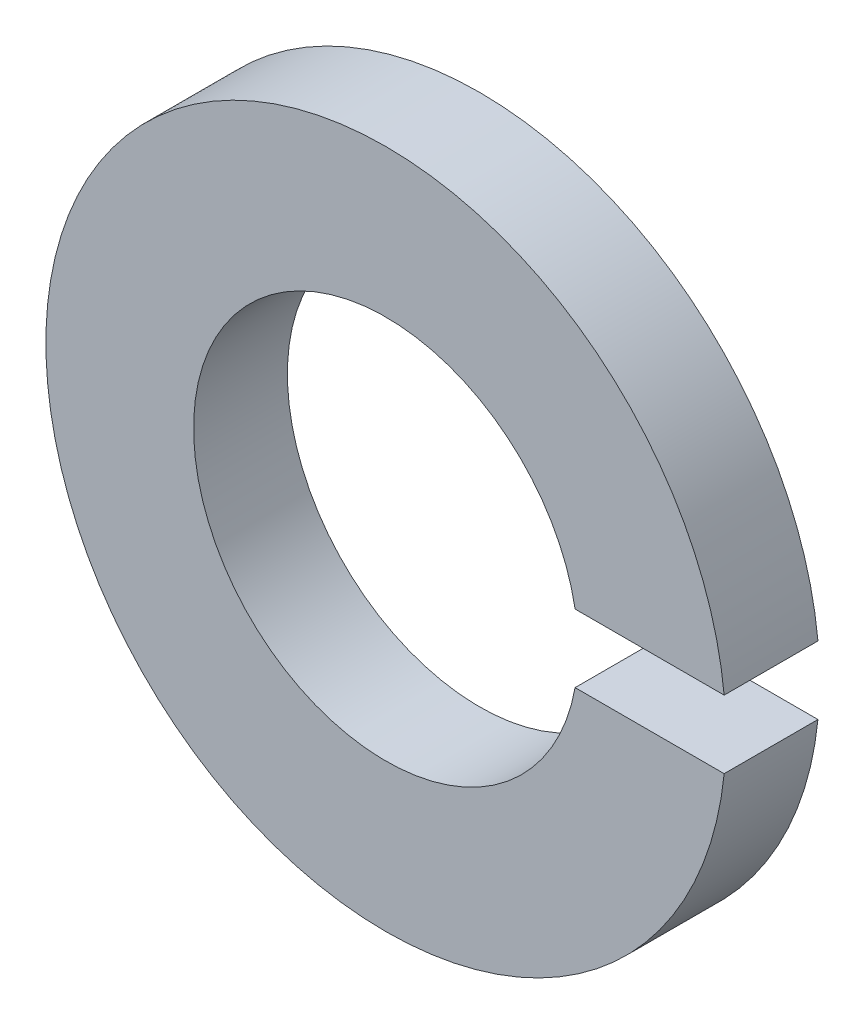
ISO-10303-21;
HEADER;
FILE_DESCRIPTION(('STEP AP214'),'2;1');
FILE_NAME('part.step','',(''),(''),'','','');
FILE_SCHEMA(('AUTOMOTIVE_DESIGN { 1 0 10303 214 1 1 1 1 }'));
ENDSEC;
DATA;
#1=APPLICATION_CONTEXT('core data for automotive mechanical design processes');
#2=APPLICATION_PROTOCOL_DEFINITION('international standard','automotive_design',2000,#1);
#3=PRODUCT_CONTEXT('',#1,'mechanical');
#4=PRODUCT('Part','Part','',(#3));
#5=PRODUCT_RELATED_PRODUCT_CATEGORY('part','',(#4));
#6=PRODUCT_DEFINITION_FORMATION('','',#4);
#7=PRODUCT_DEFINITION_CONTEXT('part definition',#1,'design');
#8=PRODUCT_DEFINITION('design','',#6,#7);
#9=PRODUCT_DEFINITION_SHAPE('','',#8);
#10=(LENGTH_UNIT() NAMED_UNIT(*) SI_UNIT(.MILLI.,.METRE.));
#11=(NAMED_UNIT(*) PLANE_ANGLE_UNIT() SI_UNIT($,.RADIAN.));
#12=(NAMED_UNIT(*) SI_UNIT($,.STERADIAN.) SOLID_ANGLE_UNIT());
#13=UNCERTAINTY_MEASURE_WITH_UNIT(LENGTH_MEASURE(1.E-05),#10,'distance_accuracy_value','');
#14=(GEOMETRIC_REPRESENTATION_CONTEXT(3) GLOBAL_UNCERTAINTY_ASSIGNED_CONTEXT((#13)) GLOBAL_UNIT_ASSIGNED_CONTEXT((#10,
#11,#12)) REPRESENTATION_CONTEXT('',''));
#15=CARTESIAN_POINT('',(0.,0.,0.));
#16=DIRECTION('',(0.,0.,1.));
#17=DIRECTION('',(1.,0.,0.));
#18=AXIS2_PLACEMENT_3D('',#15,#16,#17);
#19=CARTESIAN_POINT('',(4.0353903156944,0.725,0.));
#20=DIRECTION('',(0.,-1.,0.));
#21=DIRECTION('',(0.,0.,-1.));
#22=AXIS2_PLACEMENT_3D('',#19,#20,#21);
#23=PLANE('',#22);
#24=DIRECTION('',(-1.,0.,0.));
#25=VECTOR('',#24,1.);
#26=CARTESIAN_POINT('',(7.213658919023,0.725,0.));
#27=LINE('',#26,#25);
#28=CARTESIAN_POINT('',(4.0353903156944,0.725,0.));
#29=VERTEX_POINT('',#28);
#30=CARTESIAN_POINT('',(7.213658919023,0.725,0.));
#31=VERTEX_POINT('',#30);
#32=EDGE_CURVE('E55',#29,#31,#27,.F.);
#33=ORIENTED_EDGE('',*,*,#32,.F.);
#34=DIRECTION('',(0.,0.,-1.));
#35=VECTOR('',#34,1.);
#36=CARTESIAN_POINT('',(4.0353903156944,0.725,0.));
#37=LINE('',#36,#35);
#38=CARTESIAN_POINT('',(4.0353903156944,0.725,-2.));
#39=VERTEX_POINT('',#38);
#40=EDGE_CURVE('E67',#39,#29,#37,.F.);
#41=ORIENTED_EDGE('',*,*,#40,.F.);
#42=DIRECTION('',(1.,0.,0.));
#43=VECTOR('',#42,1.);
#44=CARTESIAN_POINT('',(4.0353903156944,0.725,-2.));
#45=LINE('',#44,#43);
#46=CARTESIAN_POINT('',(7.213658919023,0.725,-2.));
#47=VERTEX_POINT('',#46);
#48=EDGE_CURVE('E72',#39,#47,#45,.T.);
#49=ORIENTED_EDGE('',*,*,#48,.T.);
#50=DIRECTION('',(0.,0.,1.));
#51=VECTOR('',#50,1.);
#52=CARTESIAN_POINT('',(7.213658919023,0.725,-2.));
#53=LINE('',#52,#51);
#54=EDGE_CURVE('E69',#47,#31,#53,.T.);
#55=ORIENTED_EDGE('',*,*,#54,.T.);
#56=EDGE_LOOP('',(#33,#41,#49,#55));
#57=FACE_BOUND('',#56,.T.);
#58=ADVANCED_FACE('F17',(#57),#23,.T.);
#59=CARTESIAN_POINT('',(0.,0.,-2.));
#60=DIRECTION('',(0.,0.,1.));
#61=DIRECTION('',(-1.,2.71350574346867E-08,0.));
#62=AXIS2_PLACEMENT_3D('',#59,#60,#61);
#63=CYLINDRICAL_SURFACE('',#62,7.25);
#64=DIRECTION('',(0.,0.,1.));
#65=VECTOR('',#64,1.);
#66=CARTESIAN_POINT('',(7.213658919023,-0.725000000000001,-2.));
#67=LINE('',#66,#65);
#68=CARTESIAN_POINT('',(7.213658919023,-0.725000000000001,-2.));
#69=VERTEX_POINT('',#68);
#70=CARTESIAN_POINT('',(7.213658919023,-0.725000000000001,0.));
#71=VERTEX_POINT('',#70);
#72=EDGE_CURVE('E83',#69,#71,#67,.T.);
#73=ORIENTED_EDGE('',*,*,#72,.T.);
#74=CARTESIAN_POINT('',(0.,0.,0.));
#75=DIRECTION('',(0.,0.,-1.));
#76=DIRECTION('',(0.99498743710662,-0.1,0.));
#77=AXIS2_PLACEMENT_3D('',#74,#75,#76);
#78=CIRCLE('',#77,7.25);
#79=EDGE_CURVE('E88',#31,#71,#78,.F.);
#80=ORIENTED_EDGE('',*,*,#79,.F.);
#81=ORIENTED_EDGE('',*,*,#54,.F.);
#82=CARTESIAN_POINT('',(0.,0.,-2.));
#83=DIRECTION('',(0.,0.,1.));
#84=DIRECTION('',(0.99498743710662,0.0999999999999999,0.));
#85=AXIS2_PLACEMENT_3D('',#82,#83,#84);
#86=CIRCLE('',#85,7.25);
#87=EDGE_CURVE('E92',#47,#69,#86,.T.);
#88=ORIENTED_EDGE('',*,*,#87,.T.);
#89=EDGE_LOOP('',(#73,#80,#81,#88));
#90=FACE_BOUND('',#89,.T.);
#91=ADVANCED_FACE('F115',(#90),#63,.T.);
#92=CARTESIAN_POINT('',(4.0353903156944,-0.725,-2.));
#93=DIRECTION('',(0.,1.,0.));
#94=DIRECTION('',(0.,0.,1.));
#95=AXIS2_PLACEMENT_3D('',#92,#93,#94);
#96=PLANE('',#95);
#97=DIRECTION('',(1.,0.,0.));
#98=VECTOR('',#97,1.);
#99=CARTESIAN_POINT('',(4.0353903156944,-0.725,0.));
#100=LINE('',#99,#98);
#101=CARTESIAN_POINT('',(4.0353903156944,-0.725,0.));
#102=VERTEX_POINT('',#101);
#103=EDGE_CURVE('E33',#71,#102,#100,.F.);
#104=ORIENTED_EDGE('',*,*,#103,.F.);
#105=ORIENTED_EDGE('',*,*,#72,.F.);
#106=DIRECTION('',(-1.,0.,0.));
#107=VECTOR('',#106,1.);
#108=CARTESIAN_POINT('',(7.213658919023,-0.725,-2.));
#109=LINE('',#108,#107);
#110=CARTESIAN_POINT('',(4.0353903156944,-0.725,-2.));
#111=VERTEX_POINT('',#110);
#112=EDGE_CURVE('E100',#69,#111,#109,.T.);
#113=ORIENTED_EDGE('',*,*,#112,.T.);
#114=DIRECTION('',(0.,0.,1.));
#115=VECTOR('',#114,1.);
#116=CARTESIAN_POINT('',(4.0353903156944,-0.725,-2.));
#117=LINE('',#116,#115);
#118=EDGE_CURVE('E61',#111,#102,#117,.T.);
#119=ORIENTED_EDGE('',*,*,#118,.T.);
#120=EDGE_LOOP('',(#104,#105,#113,#119));
#121=FACE_BOUND('',#120,.T.);
#122=ADVANCED_FACE('F111',(#121),#96,.T.);
#123=CARTESIAN_POINT('',(0.,0.,-2.));
#124=DIRECTION('',(0.,0.,1.));
#125=DIRECTION('',(0.984241540413264,0.176829268292683,0.));
#126=AXIS2_PLACEMENT_3D('',#123,#124,#125);
#127=CYLINDRICAL_SURFACE('',#126,4.1);
#128=ORIENTED_EDGE('',*,*,#40,.T.);
#129=CARTESIAN_POINT('',(0.,0.,0.));
#130=DIRECTION('',(0.,0.,1.));
#131=DIRECTION('',(0.984241540413264,0.176829268292683,0.));
#132=AXIS2_PLACEMENT_3D('',#129,#130,#131);
#133=CIRCLE('',#132,4.1);
#134=EDGE_CURVE('E26',#29,#102,#133,.T.);
#135=ORIENTED_EDGE('',*,*,#134,.T.);
#136=ORIENTED_EDGE('',*,*,#118,.F.);
#137=CARTESIAN_POINT('',(0.,0.,-2.));
#138=DIRECTION('',(0.,0.,-1.));
#139=DIRECTION('',(0.984241540413264,-0.176829268292683,0.));
#140=AXIS2_PLACEMENT_3D('',#137,#138,#139);
#141=CIRCLE('',#140,4.1);
#142=EDGE_CURVE('E11',#39,#111,#141,.F.);
#143=ORIENTED_EDGE('',*,*,#142,.F.);
#144=EDGE_LOOP('',(#128,#135,#136,#143));
#145=FACE_BOUND('',#144,.T.);
#146=ADVANCED_FACE('F71',(#145),#127,.F.);
#147=CARTESIAN_POINT('',(-7.25080749483654,-7.24999983881597,-2.));
#148=DIRECTION('',(0.,0.,-1.));
#149=DIRECTION('',(0.,1.,0.));
#150=AXIS2_PLACEMENT_3D('',#147,#148,#149);
#151=PLANE('',#150);
#152=ORIENTED_EDGE('',*,*,#87,.F.);
#153=ORIENTED_EDGE('',*,*,#48,.F.);
#154=ORIENTED_EDGE('',*,*,#142,.T.);
#155=ORIENTED_EDGE('',*,*,#112,.F.);
#156=EDGE_LOOP('',(#152,#153,#154,#155));
#157=FACE_BOUND('',#156,.T.);
#158=ADVANCED_FACE('F113',(#157),#151,.T.);
#159=CARTESIAN_POINT('',(-7.25098089613468,-7.40443726168621,0.));
#160=DIRECTION('',(0.,0.,1.));
#161=DIRECTION('',(1.,0.,0.));
#162=AXIS2_PLACEMENT_3D('',#159,#160,#161);
#163=PLANE('',#162);
#164=ORIENTED_EDGE('',*,*,#134,.F.);
#165=ORIENTED_EDGE('',*,*,#32,.T.);
#166=ORIENTED_EDGE('',*,*,#79,.T.);
#167=ORIENTED_EDGE('',*,*,#103,.T.);
#168=EDGE_LOOP('',(#164,#165,#166,#167));
#169=FACE_BOUND('',#168,.T.);
#170=ADVANCED_FACE('F19',(#169),#163,.T.);
#171=CLOSED_SHELL('',(#58,#91,#122,#146,#158,#170));
#172=MANIFOLD_SOLID_BREP('B1',#171);
#173=ADVANCED_BREP_SHAPE_REPRESENTATION('',(#18,#172),#14);
#174=SHAPE_DEFINITION_REPRESENTATION(#9,#173);
ENDSEC;
END-ISO-10303-21;
